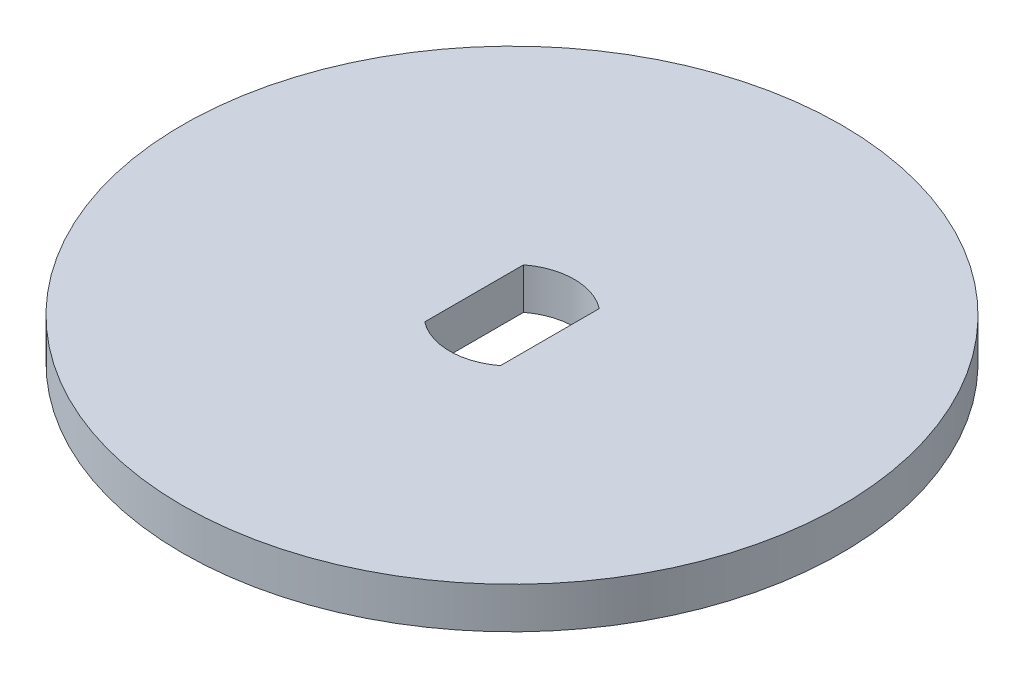
ISO-10303-21;
HEADER;
FILE_DESCRIPTION(('STEP AP214'),'2;1');
FILE_NAME('part.step','',(''),(''),'','','');
FILE_SCHEMA(('AUTOMOTIVE_DESIGN { 1 0 10303 214 1 1 1 1 }'));
ENDSEC;
DATA;
#1=APPLICATION_CONTEXT('core data for automotive mechanical design processes');
#2=APPLICATION_PROTOCOL_DEFINITION('international standard','automotive_design',2000,#1);
#3=PRODUCT_CONTEXT('',#1,'mechanical');
#4=PRODUCT('Part','Part','',(#3));
#5=PRODUCT_RELATED_PRODUCT_CATEGORY('part','',(#4));
#6=PRODUCT_DEFINITION_FORMATION('','',#4);
#7=PRODUCT_DEFINITION_CONTEXT('part definition',#1,'design');
#8=PRODUCT_DEFINITION('design','',#6,#7);
#9=PRODUCT_DEFINITION_SHAPE('','',#8);
#10=(LENGTH_UNIT() NAMED_UNIT(*) SI_UNIT(.MILLI.,.METRE.));
#11=(NAMED_UNIT(*) PLANE_ANGLE_UNIT() SI_UNIT($,.RADIAN.));
#12=(NAMED_UNIT(*) SI_UNIT($,.STERADIAN.) SOLID_ANGLE_UNIT());
#13=UNCERTAINTY_MEASURE_WITH_UNIT(LENGTH_MEASURE(1.E-05),#10,'distance_accuracy_value','');
#14=(GEOMETRIC_REPRESENTATION_CONTEXT(3) GLOBAL_UNCERTAINTY_ASSIGNED_CONTEXT((#13)) GLOBAL_UNIT_ASSIGNED_CONTEXT((#10,
#11,#12)) REPRESENTATION_CONTEXT('',''));
#15=CARTESIAN_POINT('',(0.,0.,0.));
#16=DIRECTION('',(0.,0.,1.));
#17=DIRECTION('',(1.,0.,0.));
#18=AXIS2_PLACEMENT_3D('',#15,#16,#17);
#19=CARTESIAN_POINT('',(0.,-3.175,0.));
#20=DIRECTION('',(0.,1.,0.));
#21=DIRECTION('',(0.,0.,1.));
#22=AXIS2_PLACEMENT_3D('',#19,#20,#21);
#23=CYLINDRICAL_SURFACE('',#22,25.4);
#24=CARTESIAN_POINT('',(0.,-3.175,0.));
#25=DIRECTION('',(0.,1.,0.));
#26=DIRECTION('',(0.,0.,1.));
#27=AXIS2_PLACEMENT_3D('',#24,#25,#26);
#28=CIRCLE('',#27,25.4);
#29=CARTESIAN_POINT('',(0.,-3.175,25.4));
#30=VERTEX_POINT('',#29);
#31=EDGE_CURVE('E11',#30,#30,#28,.T.);
#32=ORIENTED_EDGE('',*,*,#31,.T.);
#33=EDGE_LOOP('',(#32));
#34=FACE_BOUND('',#33,.T.);
#35=CARTESIAN_POINT('',(0.,0.,0.));
#36=DIRECTION('',(0.,1.,0.));
#37=DIRECTION('',(0.,0.,1.));
#38=AXIS2_PLACEMENT_3D('',#35,#36,#37);
#39=CIRCLE('',#38,25.4);
#40=CARTESIAN_POINT('',(0.,0.,25.4));
#41=VERTEX_POINT('',#40);
#42=EDGE_CURVE('E38',#41,#41,#39,.T.);
#43=ORIENTED_EDGE('',*,*,#42,.F.);
#44=EDGE_LOOP('',(#43));
#45=FACE_BOUND('',#44,.T.);
#46=ADVANCED_FACE('F35',(#34,#45),#23,.T.);
#47=CARTESIAN_POINT('',(0.,-3.175,0.));
#48=DIRECTION('',(0.,1.,0.));
#49=DIRECTION('',(0.,0.,1.));
#50=AXIS2_PLACEMENT_3D('',#47,#48,#49);
#51=PLANE('',#50);
#52=DIRECTION('',(0.,0.,-1.));
#53=VECTOR('',#52,1.);
#54=CARTESIAN_POINT('',(2.91957188642445,-3.175,-3.81));
#55=LINE('',#54,#53);
#56=CARTESIAN_POINT('',(2.91957188642445,-3.175,3.81));
#57=VERTEX_POINT('',#56);
#58=CARTESIAN_POINT('',(2.91957188642445,-3.175,-3.81));
#59=VERTEX_POINT('',#58);
#60=EDGE_CURVE('E83',#57,#59,#55,.T.);
#61=ORIENTED_EDGE('',*,*,#60,.T.);
#62=CARTESIAN_POINT('',(0.,-3.175,0.));
#63=DIRECTION('',(0.,1.,0.));
#64=DIRECTION('',(0.,0.,1.));
#65=AXIS2_PLACEMENT_3D('',#62,#63,#64);
#66=CIRCLE('',#65,4.8);
#67=CARTESIAN_POINT('',(-2.91957188642445,-3.175,-3.81));
#68=VERTEX_POINT('',#67);
#69=EDGE_CURVE('E77',#59,#68,#66,.T.);
#70=ORIENTED_EDGE('',*,*,#69,.T.);
#71=DIRECTION('',(0.,0.,1.));
#72=VECTOR('',#71,1.);
#73=CARTESIAN_POINT('',(-2.91957188642445,-3.175,-3.81));
#74=LINE('',#73,#72);
#75=CARTESIAN_POINT('',(-2.91957188642445,-3.175,3.81));
#76=VERTEX_POINT('',#75);
#77=EDGE_CURVE('E86',#68,#76,#74,.T.);
#78=ORIENTED_EDGE('',*,*,#77,.T.);
#79=CARTESIAN_POINT('',(0.,-3.175,0.));
#80=DIRECTION('',(0.,1.,0.));
#81=DIRECTION('',(0.,0.,1.));
#82=AXIS2_PLACEMENT_3D('',#79,#80,#81);
#83=CIRCLE('',#82,4.8);
#84=EDGE_CURVE('E49',#76,#57,#83,.T.);
#85=ORIENTED_EDGE('',*,*,#84,.T.);
#86=EDGE_LOOP('',(#61,#70,#78,#85));
#87=FACE_BOUND('',#86,.T.);
#88=ORIENTED_EDGE('',*,*,#31,.F.);
#89=EDGE_LOOP('',(#88));
#90=FACE_BOUND('',#89,.T.);
#91=ADVANCED_FACE('F90',(#87,#90),#51,.F.);
#92=CARTESIAN_POINT('',(0.,0.,0.));
#93=DIRECTION('',(0.,1.,0.));
#94=DIRECTION('',(0.,0.,1.));
#95=AXIS2_PLACEMENT_3D('',#92,#93,#94);
#96=PLANE('',#95);
#97=CARTESIAN_POINT('',(0.,0.,0.));
#98=DIRECTION('',(0.,1.,0.));
#99=DIRECTION('',(0.,0.,1.));
#100=AXIS2_PLACEMENT_3D('',#97,#98,#99);
#101=CIRCLE('',#100,4.8);
#102=CARTESIAN_POINT('',(2.91957188642445,0.,-3.81));
#103=VERTEX_POINT('',#102);
#104=CARTESIAN_POINT('',(-2.91957188642445,0.,-3.81));
#105=VERTEX_POINT('',#104);
#106=EDGE_CURVE('E57',#103,#105,#101,.T.);
#107=ORIENTED_EDGE('',*,*,#106,.F.);
#108=DIRECTION('',(0.,0.,-1.));
#109=VECTOR('',#108,1.);
#110=CARTESIAN_POINT('',(2.91957188642445,0.,-3.81));
#111=LINE('',#110,#109);
#112=CARTESIAN_POINT('',(2.91957188642445,0.,3.81));
#113=VERTEX_POINT('',#112);
#114=EDGE_CURVE('E93',#113,#103,#111,.T.);
#115=ORIENTED_EDGE('',*,*,#114,.F.);
#116=CARTESIAN_POINT('',(0.,0.,0.));
#117=DIRECTION('',(0.,1.,0.));
#118=DIRECTION('',(0.,0.,1.));
#119=AXIS2_PLACEMENT_3D('',#116,#117,#118);
#120=CIRCLE('',#119,4.8);
#121=CARTESIAN_POINT('',(-2.91957188642445,0.,3.81));
#122=VERTEX_POINT('',#121);
#123=EDGE_CURVE('E96',#122,#113,#120,.T.);
#124=ORIENTED_EDGE('',*,*,#123,.F.);
#125=DIRECTION('',(0.,0.,1.));
#126=VECTOR('',#125,1.);
#127=CARTESIAN_POINT('',(-2.91957188642445,0.,-3.81));
#128=LINE('',#127,#126);
#129=EDGE_CURVE('E102',#105,#122,#128,.T.);
#130=ORIENTED_EDGE('',*,*,#129,.F.);
#131=EDGE_LOOP('',(#107,#115,#124,#130));
#132=FACE_BOUND('',#131,.T.);
#133=ORIENTED_EDGE('',*,*,#42,.T.);
#134=EDGE_LOOP('',(#133));
#135=FACE_BOUND('',#134,.T.);
#136=ADVANCED_FACE('F114',(#132,#135),#96,.T.);
#137=CARTESIAN_POINT('',(0.,-3.175,0.));
#138=DIRECTION('',(0.,1.,0.));
#139=DIRECTION('',(0.,0.,1.));
#140=AXIS2_PLACEMENT_3D('',#137,#138,#139);
#141=CYLINDRICAL_SURFACE('',#140,4.8);
#142=ORIENTED_EDGE('',*,*,#106,.T.);
#143=DIRECTION('',(0.,1.,0.));
#144=VECTOR('',#143,1.);
#145=CARTESIAN_POINT('',(-2.91957188642445,-3.175,-3.81));
#146=LINE('',#145,#144);
#147=EDGE_CURVE('E73',#68,#105,#146,.T.);
#148=ORIENTED_EDGE('',*,*,#147,.F.);
#149=ORIENTED_EDGE('',*,*,#69,.F.);
#150=DIRECTION('',(0.,1.,0.));
#151=VECTOR('',#150,1.);
#152=CARTESIAN_POINT('',(2.91957188642445,-3.175,-3.81));
#153=LINE('',#152,#151);
#154=EDGE_CURVE('E106',#59,#103,#153,.T.);
#155=ORIENTED_EDGE('',*,*,#154,.T.);
#156=EDGE_LOOP('',(#142,#148,#149,#155));
#157=FACE_BOUND('',#156,.T.);
#158=ADVANCED_FACE('F75',(#157),#141,.F.);
#159=CARTESIAN_POINT('',(2.91957188642445,-3.175,-3.81));
#160=DIRECTION('',(1.,0.,0.));
#161=DIRECTION('',(0.,0.,-1.));
#162=AXIS2_PLACEMENT_3D('',#159,#160,#161);
#163=PLANE('',#162);
#164=ORIENTED_EDGE('',*,*,#114,.T.);
#165=ORIENTED_EDGE('',*,*,#154,.F.);
#166=ORIENTED_EDGE('',*,*,#60,.F.);
#167=DIRECTION('',(0.,1.,0.));
#168=VECTOR('',#167,1.);
#169=CARTESIAN_POINT('',(2.91957188642445,-3.175,3.81));
#170=LINE('',#169,#168);
#171=EDGE_CURVE('E108',#57,#113,#170,.T.);
#172=ORIENTED_EDGE('',*,*,#171,.T.);
#173=EDGE_LOOP('',(#164,#165,#166,#172));
#174=FACE_BOUND('',#173,.T.);
#175=ADVANCED_FACE('F117',(#174),#163,.F.);
#176=CARTESIAN_POINT('',(0.,-3.175,0.));
#177=DIRECTION('',(0.,1.,0.));
#178=DIRECTION('',(0.,0.,1.));
#179=AXIS2_PLACEMENT_3D('',#176,#177,#178);
#180=CYLINDRICAL_SURFACE('',#179,4.8);
#181=ORIENTED_EDGE('',*,*,#123,.T.);
#182=ORIENTED_EDGE('',*,*,#171,.F.);
#183=ORIENTED_EDGE('',*,*,#84,.F.);
#184=DIRECTION('',(0.,1.,0.));
#185=VECTOR('',#184,1.);
#186=CARTESIAN_POINT('',(-2.91957188642445,-3.175,3.81));
#187=LINE('',#186,#185);
#188=EDGE_CURVE('E82',#76,#122,#187,.T.);
#189=ORIENTED_EDGE('',*,*,#188,.T.);
#190=EDGE_LOOP('',(#181,#182,#183,#189));
#191=FACE_BOUND('',#190,.T.);
#192=ADVANCED_FACE('F110',(#191),#180,.F.);
#193=CARTESIAN_POINT('',(-2.91957188642445,-3.175,-3.81));
#194=DIRECTION('',(-1.,0.,0.));
#195=DIRECTION('',(0.,0.,1.));
#196=AXIS2_PLACEMENT_3D('',#193,#194,#195);
#197=PLANE('',#196);
#198=ORIENTED_EDGE('',*,*,#129,.T.);
#199=ORIENTED_EDGE('',*,*,#188,.F.);
#200=ORIENTED_EDGE('',*,*,#77,.F.);
#201=ORIENTED_EDGE('',*,*,#147,.T.);
#202=EDGE_LOOP('',(#198,#199,#200,#201));
#203=FACE_BOUND('',#202,.T.);
#204=ADVANCED_FACE('F87',(#203),#197,.F.);
#205=CLOSED_SHELL('',(#46,#91,#136,#158,#175,#192,#204));
#206=MANIFOLD_SOLID_BREP('B2',#205);
#207=ADVANCED_BREP_SHAPE_REPRESENTATION('',(#18,#206),#14);
#208=SHAPE_DEFINITION_REPRESENTATION(#9,#207);
ENDSEC;
END-ISO-10303-21;
